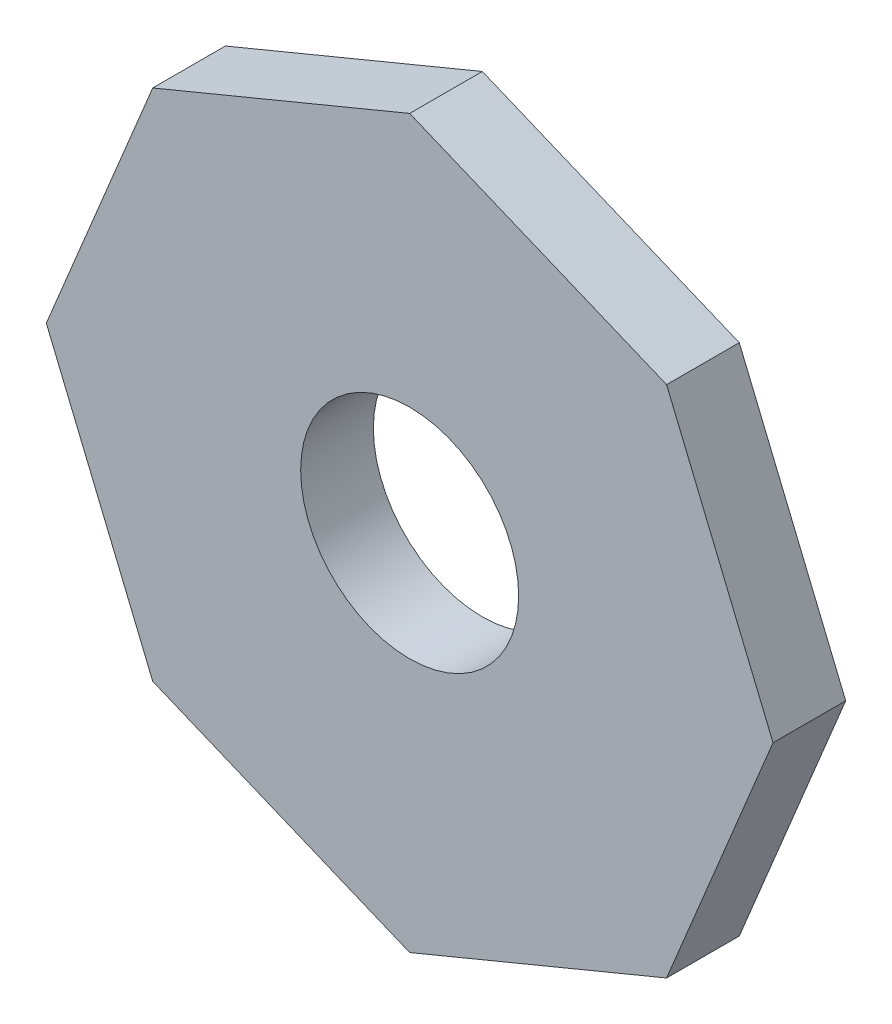
ISO-10303-21;
HEADER;
FILE_DESCRIPTION(('STEP AP214'),'2;1');
FILE_NAME('part.step','',(''),(''),'','','');
FILE_SCHEMA(('AUTOMOTIVE_DESIGN { 1 0 10303 214 1 1 1 1 }'));
ENDSEC;
DATA;
#1=APPLICATION_CONTEXT('core data for automotive mechanical design processes');
#2=APPLICATION_PROTOCOL_DEFINITION('international standard','automotive_design',2000,#1);
#3=PRODUCT_CONTEXT('',#1,'mechanical');
#4=PRODUCT('Part','Part','',(#3));
#5=PRODUCT_RELATED_PRODUCT_CATEGORY('part','',(#4));
#6=PRODUCT_DEFINITION_FORMATION('','',#4);
#7=PRODUCT_DEFINITION_CONTEXT('part definition',#1,'design');
#8=PRODUCT_DEFINITION('design','',#6,#7);
#9=PRODUCT_DEFINITION_SHAPE('','',#8);
#10=(LENGTH_UNIT() NAMED_UNIT(*) SI_UNIT(.MILLI.,.METRE.));
#11=(NAMED_UNIT(*) PLANE_ANGLE_UNIT() SI_UNIT($,.RADIAN.));
#12=(NAMED_UNIT(*) SI_UNIT($,.STERADIAN.) SOLID_ANGLE_UNIT());
#13=UNCERTAINTY_MEASURE_WITH_UNIT(LENGTH_MEASURE(1.E-05),#10,'distance_accuracy_value','');
#14=(GEOMETRIC_REPRESENTATION_CONTEXT(3) GLOBAL_UNCERTAINTY_ASSIGNED_CONTEXT((#13)) GLOBAL_UNIT_ASSIGNED_CONTEXT((#10,
#11,#12)) REPRESENTATION_CONTEXT('',''));
#15=CARTESIAN_POINT('',(0.,0.,0.));
#16=DIRECTION('',(0.,0.,1.));
#17=DIRECTION('',(1.,0.,0.));
#18=AXIS2_PLACEMENT_3D('',#15,#16,#17);
#19=CARTESIAN_POINT('',(70.7106781186552,-70.7106781186543,20.));
#20=DIRECTION('',(-0.923879532511289,0.382683432365084,0.));
#21=DIRECTION('',(-0.382683432365084,-0.923879532511289,0.));
#22=AXIS2_PLACEMENT_3D('',#19,#20,#21);
#23=PLANE('',#22);
#24=DIRECTION('',(0.382683432365084,0.923879532511289,0.));
#25=VECTOR('',#24,1.);
#26=CARTESIAN_POINT('',(70.7106781186552,-70.7106781186543,0.));
#27=LINE('',#26,#25);
#28=CARTESIAN_POINT('',(70.7106781186552,-70.7106781186543,0.));
#29=VERTEX_POINT('',#28);
#30=CARTESIAN_POINT('',(100.,5.96744875736022E-13,0.));
#31=VERTEX_POINT('',#30);
#32=EDGE_CURVE('E137',#29,#31,#27,.T.);
#33=ORIENTED_EDGE('',*,*,#32,.T.);
#34=DIRECTION('',(0.,0.,-1.));
#35=VECTOR('',#34,1.);
#36=CARTESIAN_POINT('',(100.,5.96744875736022E-13,20.));
#37=LINE('',#36,#35);
#38=CARTESIAN_POINT('',(100.,5.96744875736022E-13,20.));
#39=VERTEX_POINT('',#38);
#40=EDGE_CURVE('E11',#39,#31,#37,.T.);
#41=ORIENTED_EDGE('',*,*,#40,.F.);
#42=DIRECTION('',(0.382683432365084,0.923879532511289,0.));
#43=VECTOR('',#42,1.);
#44=CARTESIAN_POINT('',(70.7106781186552,-70.7106781186543,20.));
#45=LINE('',#44,#43);
#46=CARTESIAN_POINT('',(70.7106781186552,-70.7106781186543,20.));
#47=VERTEX_POINT('',#46);
#48=EDGE_CURVE('E152',#47,#39,#45,.T.);
#49=ORIENTED_EDGE('',*,*,#48,.F.);
#50=DIRECTION('',(0.,0.,-1.));
#51=VECTOR('',#50,1.);
#52=CARTESIAN_POINT('',(70.7106781186552,-70.7106781186543,20.));
#53=LINE('',#52,#51);
#54=EDGE_CURVE('E133',#47,#29,#53,.T.);
#55=ORIENTED_EDGE('',*,*,#54,.T.);
#56=EDGE_LOOP('',(#33,#41,#49,#55));
#57=FACE_BOUND('',#56,.T.);
#58=ADVANCED_FACE('F41',(#57),#23,.F.);
#59=CARTESIAN_POINT('',(100.,5.96744875736022E-13,20.));
#60=DIRECTION('',(-0.923879532511284,-0.382683432365096,0.));
#61=DIRECTION('',(0.382683432365096,-0.923879532511284,0.));
#62=AXIS2_PLACEMENT_3D('',#59,#60,#61);
#63=PLANE('',#62);
#64=DIRECTION('',(-0.382683432365096,0.923879532511284,0.));
#65=VECTOR('',#64,1.);
#66=CARTESIAN_POINT('',(100.,5.96744875736022E-13,0.));
#67=LINE('',#66,#65);
#68=CARTESIAN_POINT('',(70.7106781186543,70.7106781186552,0.));
#69=VERTEX_POINT('',#68);
#70=EDGE_CURVE('E140',#31,#69,#67,.T.);
#71=ORIENTED_EDGE('',*,*,#70,.T.);
#72=DIRECTION('',(0.,0.,-1.));
#73=VECTOR('',#72,1.);
#74=CARTESIAN_POINT('',(70.7106781186543,70.7106781186552,20.));
#75=LINE('',#74,#73);
#76=CARTESIAN_POINT('',(70.7106781186543,70.7106781186552,20.));
#77=VERTEX_POINT('',#76);
#78=EDGE_CURVE('E49',#77,#69,#75,.T.);
#79=ORIENTED_EDGE('',*,*,#78,.F.);
#80=DIRECTION('',(-0.382683432365096,0.923879532511284,0.));
#81=VECTOR('',#80,1.);
#82=CARTESIAN_POINT('',(100.,5.96744875736022E-13,20.));
#83=LINE('',#82,#81);
#84=EDGE_CURVE('E100',#39,#77,#83,.T.);
#85=ORIENTED_EDGE('',*,*,#84,.F.);
#86=ORIENTED_EDGE('',*,*,#40,.T.);
#87=EDGE_LOOP('',(#71,#79,#85,#86));
#88=FACE_BOUND('',#87,.T.);
#89=ADVANCED_FACE('F206',(#88),#63,.F.);
#90=CARTESIAN_POINT('',(70.7106781186543,70.7106781186552,20.));
#91=DIRECTION('',(-0.382683432365084,-0.923879532511289,0.));
#92=DIRECTION('',(0.923879532511289,-0.382683432365084,0.));
#93=AXIS2_PLACEMENT_3D('',#90,#91,#92);
#94=PLANE('',#93);
#95=DIRECTION('',(-0.923879532511289,0.382683432365084,0.));
#96=VECTOR('',#95,1.);
#97=CARTESIAN_POINT('',(70.7106781186543,70.7106781186552,0.));
#98=LINE('',#97,#96);
#99=CARTESIAN_POINT('',(-6.24500451351651E-13,100.,0.));
#100=VERTEX_POINT('',#99);
#101=EDGE_CURVE('E143',#69,#100,#98,.T.);
#102=ORIENTED_EDGE('',*,*,#101,.T.);
#103=DIRECTION('',(0.,0.,-1.));
#104=VECTOR('',#103,1.);
#105=CARTESIAN_POINT('',(-6.24500451351651E-13,100.,20.));
#106=LINE('',#105,#104);
#107=CARTESIAN_POINT('',(-6.24500451351651E-13,100.,20.));
#108=VERTEX_POINT('',#107);
#109=EDGE_CURVE('E159',#108,#100,#106,.T.);
#110=ORIENTED_EDGE('',*,*,#109,.F.);
#111=DIRECTION('',(-0.923879532511289,0.382683432365084,0.));
#112=VECTOR('',#111,1.);
#113=CARTESIAN_POINT('',(70.7106781186543,70.7106781186552,20.));
#114=LINE('',#113,#112);
#115=EDGE_CURVE('E167',#77,#108,#114,.T.);
#116=ORIENTED_EDGE('',*,*,#115,.F.);
#117=ORIENTED_EDGE('',*,*,#78,.T.);
#118=EDGE_LOOP('',(#102,#110,#116,#117));
#119=FACE_BOUND('',#118,.T.);
#120=ADVANCED_FACE('F165',(#119),#94,.F.);
#121=CARTESIAN_POINT('',(-6.24500451351651E-13,100.,20.));
#122=DIRECTION('',(0.382683432365096,-0.923879532511284,0.));
#123=DIRECTION('',(0.923879532511284,0.382683432365096,0.));
#124=AXIS2_PLACEMENT_3D('',#121,#122,#123);
#125=PLANE('',#124);
#126=DIRECTION('',(-0.923879532511284,-0.382683432365096,0.));
#127=VECTOR('',#126,1.);
#128=CARTESIAN_POINT('',(-6.24500451351651E-13,100.,0.));
#129=LINE('',#128,#127);
#130=CARTESIAN_POINT('',(-70.7106781186552,70.7106781186543,0.));
#131=VERTEX_POINT('',#130);
#132=EDGE_CURVE('E145',#100,#131,#129,.T.);
#133=ORIENTED_EDGE('',*,*,#132,.T.);
#134=DIRECTION('',(0.,0.,-1.));
#135=VECTOR('',#134,1.);
#136=CARTESIAN_POINT('',(-70.7106781186552,70.7106781186543,20.));
#137=LINE('',#136,#135);
#138=CARTESIAN_POINT('',(-70.7106781186552,70.7106781186543,20.));
#139=VERTEX_POINT('',#138);
#140=EDGE_CURVE('E156',#139,#131,#137,.T.);
#141=ORIENTED_EDGE('',*,*,#140,.F.);
#142=DIRECTION('',(-0.923879532511284,-0.382683432365096,0.));
#143=VECTOR('',#142,1.);
#144=CARTESIAN_POINT('',(-6.24500451351651E-13,100.,20.));
#145=LINE('',#144,#143);
#146=EDGE_CURVE('E179',#108,#139,#145,.T.);
#147=ORIENTED_EDGE('',*,*,#146,.F.);
#148=ORIENTED_EDGE('',*,*,#109,.T.);
#149=EDGE_LOOP('',(#133,#141,#147,#148));
#150=FACE_BOUND('',#149,.T.);
#151=ADVANCED_FACE('F175',(#150),#125,.F.);
#152=CARTESIAN_POINT('',(-70.7106781186552,70.7106781186543,20.));
#153=DIRECTION('',(0.923879532511289,-0.382683432365084,0.));
#154=DIRECTION('',(0.382683432365084,0.923879532511289,0.));
#155=AXIS2_PLACEMENT_3D('',#152,#153,#154);
#156=PLANE('',#155);
#157=DIRECTION('',(-0.382683432365084,-0.923879532511289,0.));
#158=VECTOR('',#157,1.);
#159=CARTESIAN_POINT('',(-70.7106781186552,70.7106781186543,0.));
#160=LINE('',#159,#158);
#161=CARTESIAN_POINT('',(-100.,-6.98296267768627E-13,0.));
#162=VERTEX_POINT('',#161);
#163=EDGE_CURVE('E147',#131,#162,#160,.T.);
#164=ORIENTED_EDGE('',*,*,#163,.T.);
#165=DIRECTION('',(0.,0.,-1.));
#166=VECTOR('',#165,1.);
#167=CARTESIAN_POINT('',(-100.,-6.98296267768627E-13,20.));
#168=LINE('',#167,#166);
#169=CARTESIAN_POINT('',(-100.,-6.98296267768627E-13,20.));
#170=VERTEX_POINT('',#169);
#171=EDGE_CURVE('E128',#170,#162,#168,.T.);
#172=ORIENTED_EDGE('',*,*,#171,.F.);
#173=DIRECTION('',(-0.382683432365084,-0.923879532511289,0.));
#174=VECTOR('',#173,1.);
#175=CARTESIAN_POINT('',(-70.7106781186552,70.7106781186543,20.));
#176=LINE('',#175,#174);
#177=EDGE_CURVE('E119',#139,#170,#176,.T.);
#178=ORIENTED_EDGE('',*,*,#177,.F.);
#179=ORIENTED_EDGE('',*,*,#140,.T.);
#180=EDGE_LOOP('',(#164,#172,#178,#179));
#181=FACE_BOUND('',#180,.T.);
#182=ADVANCED_FACE('F178',(#181),#156,.F.);
#183=CARTESIAN_POINT('',(-100.,-6.98296267768627E-13,20.));
#184=DIRECTION('',(0.923879532511284,0.382683432365096,0.));
#185=DIRECTION('',(-0.382683432365096,0.923879532511284,0.));
#186=AXIS2_PLACEMENT_3D('',#183,#184,#185);
#187=PLANE('',#186);
#188=DIRECTION('',(0.382683432365096,-0.923879532511284,0.));
#189=VECTOR('',#188,1.);
#190=CARTESIAN_POINT('',(-100.,-6.98296267768627E-13,0.));
#191=LINE('',#190,#189);
#192=CARTESIAN_POINT('',(-70.7106781186543,-70.7106781186552,0.));
#193=VERTEX_POINT('',#192);
#194=EDGE_CURVE('E127',#162,#193,#191,.T.);
#195=ORIENTED_EDGE('',*,*,#194,.T.);
#196=DIRECTION('',(0.,0.,-1.));
#197=VECTOR('',#196,1.);
#198=CARTESIAN_POINT('',(-70.7106781186543,-70.7106781186552,20.));
#199=LINE('',#198,#197);
#200=CARTESIAN_POINT('',(-70.7106781186543,-70.7106781186552,20.));
#201=VERTEX_POINT('',#200);
#202=EDGE_CURVE('E124',#201,#193,#199,.T.);
#203=ORIENTED_EDGE('',*,*,#202,.F.);
#204=DIRECTION('',(0.382683432365096,-0.923879532511284,0.));
#205=VECTOR('',#204,1.);
#206=CARTESIAN_POINT('',(-100.,-6.98296267768627E-13,20.));
#207=LINE('',#206,#205);
#208=EDGE_CURVE('E113',#170,#201,#207,.T.);
#209=ORIENTED_EDGE('',*,*,#208,.F.);
#210=ORIENTED_EDGE('',*,*,#171,.T.);
#211=EDGE_LOOP('',(#195,#203,#209,#210));
#212=FACE_BOUND('',#211,.T.);
#213=ADVANCED_FACE('F125',(#212),#187,.F.);
#214=CARTESIAN_POINT('',(-70.7106781186543,-70.7106781186552,20.));
#215=DIRECTION('',(0.382683432365084,0.923879532511289,0.));
#216=DIRECTION('',(-0.923879532511289,0.382683432365084,0.));
#217=AXIS2_PLACEMENT_3D('',#214,#215,#216);
#218=PLANE('',#217);
#219=DIRECTION('',(0.923879532511289,-0.382683432365084,0.));
#220=VECTOR('',#219,1.);
#221=CARTESIAN_POINT('',(-70.7106781186543,-70.7106781186552,0.));
#222=LINE('',#221,#220);
#223=CARTESIAN_POINT('',(6.67370208986572E-13,-100.,0.));
#224=VERTEX_POINT('',#223);
#225=EDGE_CURVE('E86',#193,#224,#222,.T.);
#226=ORIENTED_EDGE('',*,*,#225,.T.);
#227=DIRECTION('',(0.,0.,-1.));
#228=VECTOR('',#227,1.);
#229=CARTESIAN_POINT('',(6.67370208986572E-13,-100.,20.));
#230=LINE('',#229,#228);
#231=CARTESIAN_POINT('',(6.67370208986572E-13,-100.,20.));
#232=VERTEX_POINT('',#231);
#233=EDGE_CURVE('E129',#232,#224,#230,.T.);
#234=ORIENTED_EDGE('',*,*,#233,.F.);
#235=DIRECTION('',(0.923879532511289,-0.382683432365084,0.));
#236=VECTOR('',#235,1.);
#237=CARTESIAN_POINT('',(-70.7106781186543,-70.7106781186552,20.));
#238=LINE('',#237,#236);
#239=EDGE_CURVE('E117',#201,#232,#238,.T.);
#240=ORIENTED_EDGE('',*,*,#239,.F.);
#241=ORIENTED_EDGE('',*,*,#202,.T.);
#242=EDGE_LOOP('',(#226,#234,#240,#241));
#243=FACE_BOUND('',#242,.T.);
#244=ADVANCED_FACE('F131',(#243),#218,.F.);
#245=CARTESIAN_POINT('',(6.67370208986572E-13,-100.,20.));
#246=DIRECTION('',(-0.382683432365096,0.923879532511284,0.));
#247=DIRECTION('',(-0.923879532511284,-0.382683432365096,0.));
#248=AXIS2_PLACEMENT_3D('',#245,#246,#247);
#249=PLANE('',#248);
#250=DIRECTION('',(0.923879532511284,0.382683432365096,0.));
#251=VECTOR('',#250,1.);
#252=CARTESIAN_POINT('',(6.67370208986572E-13,-100.,0.));
#253=LINE('',#252,#251);
#254=EDGE_CURVE('E92',#224,#29,#253,.T.);
#255=ORIENTED_EDGE('',*,*,#254,.T.);
#256=ORIENTED_EDGE('',*,*,#54,.F.);
#257=DIRECTION('',(0.923879532511284,0.382683432365096,0.));
#258=VECTOR('',#257,1.);
#259=CARTESIAN_POINT('',(6.67370208986572E-13,-100.,20.));
#260=LINE('',#259,#258);
#261=EDGE_CURVE('E57',#232,#47,#260,.T.);
#262=ORIENTED_EDGE('',*,*,#261,.F.);
#263=ORIENTED_EDGE('',*,*,#233,.T.);
#264=EDGE_LOOP('',(#255,#256,#262,#263));
#265=FACE_BOUND('',#264,.T.);
#266=ADVANCED_FACE('F195',(#265),#249,.F.);
#267=CARTESIAN_POINT('',(0.,0.,20.));
#268=DIRECTION('',(0.,0.,1.));
#269=DIRECTION('',(1.,0.,0.));
#270=AXIS2_PLACEMENT_3D('',#267,#268,#269);
#271=PLANE('',#270);
#272=CARTESIAN_POINT('',(0.,0.,20.));
#273=DIRECTION('',(0.,0.,1.));
#274=DIRECTION('',(1.,0.,0.));
#275=AXIS2_PLACEMENT_3D('',#272,#273,#274);
#276=CIRCLE('',#275,30.);
#277=CARTESIAN_POINT('',(30.,0.,20.));
#278=VERTEX_POINT('',#277);
#279=EDGE_CURVE('E141',#278,#278,#276,.T.);
#280=ORIENTED_EDGE('',*,*,#279,.F.);
#281=EDGE_LOOP('',(#280));
#282=FACE_BOUND('',#281,.T.);
#283=ORIENTED_EDGE('',*,*,#48,.T.);
#284=ORIENTED_EDGE('',*,*,#84,.T.);
#285=ORIENTED_EDGE('',*,*,#115,.T.);
#286=ORIENTED_EDGE('',*,*,#146,.T.);
#287=ORIENTED_EDGE('',*,*,#177,.T.);
#288=ORIENTED_EDGE('',*,*,#208,.T.);
#289=ORIENTED_EDGE('',*,*,#239,.T.);
#290=ORIENTED_EDGE('',*,*,#261,.T.);
#291=EDGE_LOOP('',(#283,#284,#285,#286,#287,#288,#289,#290));
#292=FACE_BOUND('',#291,.T.);
#293=ADVANCED_FACE('F115',(#282,#292),#271,.T.);
#294=CARTESIAN_POINT('',(0.,0.,0.));
#295=DIRECTION('',(0.,0.,1.));
#296=DIRECTION('',(1.,0.,0.));
#297=AXIS2_PLACEMENT_3D('',#294,#295,#296);
#298=PLANE('',#297);
#299=CARTESIAN_POINT('',(0.,0.,0.));
#300=DIRECTION('',(0.,0.,1.));
#301=DIRECTION('',(1.,0.,0.));
#302=AXIS2_PLACEMENT_3D('',#299,#300,#301);
#303=CIRCLE('',#302,30.);
#304=CARTESIAN_POINT('',(30.,0.,0.));
#305=VERTEX_POINT('',#304);
#306=EDGE_CURVE('E185',#305,#305,#303,.T.);
#307=ORIENTED_EDGE('',*,*,#306,.T.);
#308=EDGE_LOOP('',(#307));
#309=FACE_BOUND('',#308,.T.);
#310=ORIENTED_EDGE('',*,*,#32,.F.);
#311=ORIENTED_EDGE('',*,*,#254,.F.);
#312=ORIENTED_EDGE('',*,*,#225,.F.);
#313=ORIENTED_EDGE('',*,*,#194,.F.);
#314=ORIENTED_EDGE('',*,*,#163,.F.);
#315=ORIENTED_EDGE('',*,*,#132,.F.);
#316=ORIENTED_EDGE('',*,*,#101,.F.);
#317=ORIENTED_EDGE('',*,*,#70,.F.);
#318=EDGE_LOOP('',(#310,#311,#312,#313,#314,#315,#316,#317));
#319=FACE_BOUND('',#318,.T.);
#320=ADVANCED_FACE('F171',(#309,#319),#298,.F.);
#321=CARTESIAN_POINT('',(0.,0.,20.));
#322=DIRECTION('',(0.,0.,-1.));
#323=DIRECTION('',(-1.,0.,0.));
#324=AXIS2_PLACEMENT_3D('',#321,#322,#323);
#325=CYLINDRICAL_SURFACE('',#324,30.);
#326=ORIENTED_EDGE('',*,*,#279,.T.);
#327=EDGE_LOOP('',(#326));
#328=FACE_BOUND('',#327,.T.);
#329=ORIENTED_EDGE('',*,*,#306,.F.);
#330=EDGE_LOOP('',(#329));
#331=FACE_BOUND('',#330,.T.);
#332=ADVANCED_FACE('F191',(#328,#331),#325,.F.);
#333=CLOSED_SHELL('',(#58,#89,#120,#151,#182,#213,#244,#266,#293,#320,#332));
#334=MANIFOLD_SOLID_BREP('B2',#333);
#335=ADVANCED_BREP_SHAPE_REPRESENTATION('',(#18,#334),#14);
#336=SHAPE_DEFINITION_REPRESENTATION(#9,#335);
ENDSEC;
END-ISO-10303-21;
